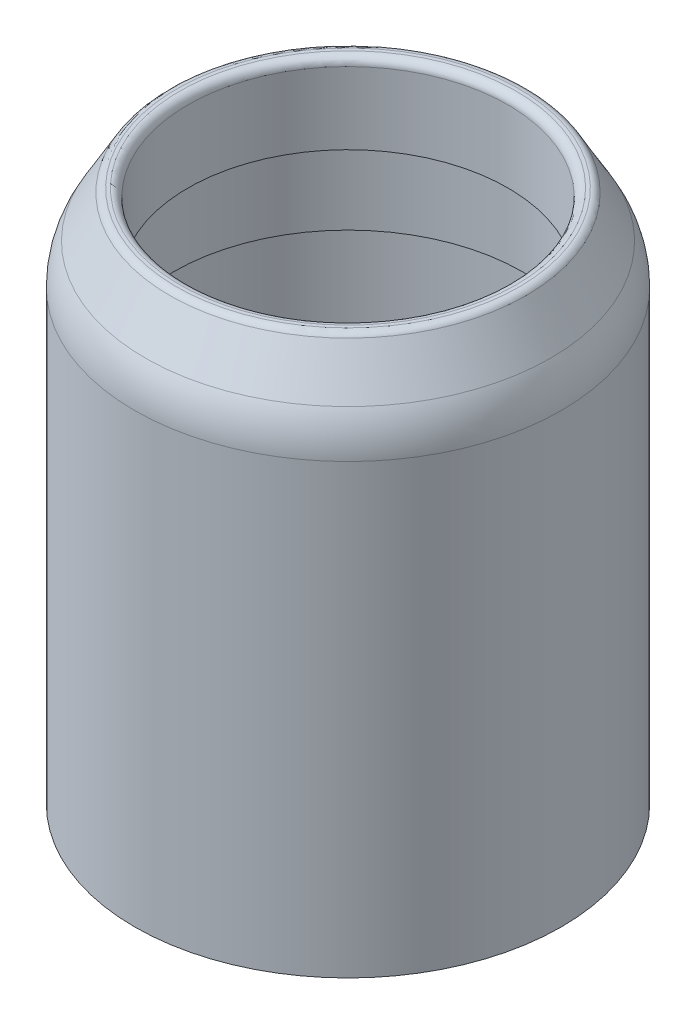
ISO-10303-21;
HEADER;
FILE_DESCRIPTION(('STEP AP214'),'2;1');
FILE_NAME('part.step','',(''),(''),'','','');
FILE_SCHEMA(('AUTOMOTIVE_DESIGN { 1 0 10303 214 1 1 1 1 }'));
ENDSEC;
DATA;
#1=APPLICATION_CONTEXT('core data for automotive mechanical design processes');
#2=APPLICATION_PROTOCOL_DEFINITION('international standard','automotive_design',2000,#1);
#3=PRODUCT_CONTEXT('',#1,'mechanical');
#4=PRODUCT('Part','Part','',(#3));
#5=PRODUCT_RELATED_PRODUCT_CATEGORY('part','',(#4));
#6=PRODUCT_DEFINITION_FORMATION('','',#4);
#7=PRODUCT_DEFINITION_CONTEXT('part definition',#1,'design');
#8=PRODUCT_DEFINITION('design','',#6,#7);
#9=PRODUCT_DEFINITION_SHAPE('','',#8);
#10=(LENGTH_UNIT() NAMED_UNIT(*) SI_UNIT(.MILLI.,.METRE.));
#11=(NAMED_UNIT(*) PLANE_ANGLE_UNIT() SI_UNIT($,.RADIAN.));
#12=(NAMED_UNIT(*) SI_UNIT($,.STERADIAN.) SOLID_ANGLE_UNIT());
#13=UNCERTAINTY_MEASURE_WITH_UNIT(LENGTH_MEASURE(1.E-05),#10,'distance_accuracy_value','');
#14=(GEOMETRIC_REPRESENTATION_CONTEXT(3) GLOBAL_UNCERTAINTY_ASSIGNED_CONTEXT((#13)) GLOBAL_UNIT_ASSIGNED_CONTEXT((#10,
#11,#12)) REPRESENTATION_CONTEXT('',''));
#15=CARTESIAN_POINT('',(0.,0.,0.));
#16=DIRECTION('',(0.,0.,1.));
#17=DIRECTION('',(1.,0.,0.));
#18=AXIS2_PLACEMENT_3D('',#15,#16,#17);
#19=CARTESIAN_POINT('',(6.,-0.3,0.));
#20=DIRECTION('',(0.,-1.,0.));
#21=DIRECTION('',(-0.999976494297205,0.,0.00685644609634003));
#22=AXIS2_PLACEMENT_3D('',#19,#20,#21);
#23=TOROIDAL_SURFACE('',#22,6.426794919243,0.3);
#24=CARTESIAN_POINT('',(6.,-0.1499999400314,0.));
#25=DIRECTION('',(0.,-1.,0.));
#26=DIRECTION('',(-1.,0.,0.));
#27=AXIS2_PLACEMENT_3D('',#24,#25,#26);
#28=CIRCLE('',#27,6.686602505756);
#29=CARTESIAN_POINT('',(12.6866025057556,-0.149999940031651,0.));
#30=VERTEX_POINT('',#29);
#31=CARTESIAN_POINT('',(12.6864453324648,-0.1499999400314,-0.0458463296483674));
#32=VERTEX_POINT('',#31);
#33=EDGE_CURVE('E129',#30,#32,#28,.T.);
#34=ORIENTED_EDGE('',*,*,#33,.F.);
#35=CARTESIAN_POINT('',(6.,-0.1499999400314,0.));
#36=DIRECTION('',(0.,-1.,0.));
#37=DIRECTION('',(-1.,0.,0.));
#38=AXIS2_PLACEMENT_3D('',#35,#36,#37);
#39=CIRCLE('',#38,6.686602505756);
#40=EDGE_CURVE('E28',#32,#30,#39,.T.);
#41=ORIENTED_EDGE('',*,*,#40,.F.);
#42=CARTESIAN_POINT('',(12.4266438529117,-0.3,-0.0440649729360208));
#43=DIRECTION('',(0.00685644609633991,0.,0.999976494297205));
#44=DIRECTION('',(0.999976494297205,0.,-0.00685644609633991));
#45=AXIS2_PLACEMENT_3D('',#42,#43,#44);
#46=CIRCLE('',#45,0.3);
#47=CARTESIAN_POINT('',(12.4266437255407,0.,-0.0440649720626879));
#48=VERTEX_POINT('',#47);
#49=EDGE_CURVE('E11',#32,#48,#46,.T.);
#50=ORIENTED_EDGE('',*,*,#49,.T.);
#51=CARTESIAN_POINT('',(6.,0.,0.));
#52=DIRECTION('',(0.,-1.,0.));
#53=DIRECTION('',(-1.,0.,0.));
#54=AXIS2_PLACEMENT_3D('',#51,#52,#53);
#55=CIRCLE('',#54,6.426794791869);
#56=EDGE_CURVE('E136',#48,#48,#55,.T.);
#57=ORIENTED_EDGE('',*,*,#56,.T.);
#58=ORIENTED_EDGE('',*,*,#49,.F.);
#59=EDGE_LOOP('',(#34,#41,#50,#57,#58));
#60=FACE_BOUND('',#59,.T.);
#61=ADVANCED_FACE('F17',(#60),#23,.T.);
#62=CARTESIAN_POINT('',(6.,-0.9393592638354,0.));
#63=DIRECTION('',(0.,-1.,0.));
#64=DIRECTION('',(-1.,0.,0.));
#65=AXIS2_PLACEMENT_3D('',#62,#63,#64);
#66=CONICAL_SURFACE('',#65,7.142339323841,0.523598775598299);
#67=CARTESIAN_POINT('',(6.,-1.72871870789,0.));
#68=DIRECTION('',(0.,1.,0.));
#69=DIRECTION('',(-1.,0.,0.));
#70=AXIS2_PLACEMENT_3D('',#67,#68,#69);
#71=CIRCLE('',#70,7.598076211353);
#72=CARTESIAN_POINT('',(13.598076211353,-1.72871870789,0.));
#73=VERTEX_POINT('',#72);
#74=EDGE_CURVE('E152',#73,#73,#71,.T.);
#75=ORIENTED_EDGE('',*,*,#74,.T.);
#76=DIRECTION('',(-0.5,0.866025403784439,0.));
#77=VECTOR('',#76,1.);
#78=CARTESIAN_POINT('',(13.142339323841,-0.9393592638354,0.));
#79=LINE('',#78,#77);
#80=EDGE_CURVE('E133',#73,#30,#79,.T.);
#81=ORIENTED_EDGE('',*,*,#80,.T.);
#82=ORIENTED_EDGE('',*,*,#33,.T.);
#83=ORIENTED_EDGE('',*,*,#40,.T.);
#84=ORIENTED_EDGE('',*,*,#80,.F.);
#85=EDGE_LOOP('',(#75,#81,#82,#83,#84));
#86=FACE_BOUND('',#85,.T.);
#87=ADVANCED_FACE('F19',(#86),#66,.T.);
#88=CARTESIAN_POINT('',(6.,-3.22871870789,0.));
#89=DIRECTION('',(0.,-1.,0.));
#90=DIRECTION('',(-1.,0.,0.));
#91=AXIS2_PLACEMENT_3D('',#88,#89,#90);
#92=TOROIDAL_SURFACE('',#91,5.,3.);
#93=CARTESIAN_POINT('',(6.,-3.22871870789,0.));
#94=DIRECTION('',(0.,-1.,0.));
#95=DIRECTION('',(-1.,0.,0.));
#96=AXIS2_PLACEMENT_3D('',#93,#94,#95);
#97=CIRCLE('',#96,8.);
#98=CARTESIAN_POINT('',(14.,-3.22871870789,0.));
#99=VERTEX_POINT('',#98);
#100=EDGE_CURVE('E114',#99,#99,#97,.T.);
#101=ORIENTED_EDGE('',*,*,#100,.F.);
#102=CARTESIAN_POINT('',(11.,-3.22871870789,0.));
#103=DIRECTION('',(0.,0.,1.));
#104=DIRECTION('',(1.,0.,0.));
#105=AXIS2_PLACEMENT_3D('',#102,#103,#104);
#106=CIRCLE('',#105,3.);
#107=EDGE_CURVE('E187',#99,#73,#106,.T.);
#108=ORIENTED_EDGE('',*,*,#107,.T.);
#109=ORIENTED_EDGE('',*,*,#74,.F.);
#110=ORIENTED_EDGE('',*,*,#107,.F.);
#111=EDGE_LOOP('',(#101,#108,#109,#110));
#112=FACE_BOUND('',#111,.T.);
#113=ADVANCED_FACE('F202',(#112),#92,.T.);
#114=CARTESIAN_POINT('',(6.,1.,0.));
#115=DIRECTION('',(0.,-1.,0.));
#116=DIRECTION('',(-1.,0.,0.));
#117=AXIS2_PLACEMENT_3D('',#114,#115,#116);
#118=CYLINDRICAL_SURFACE('',#117,8.);
#119=CARTESIAN_POINT('',(6.,-20.,0.));
#120=DIRECTION('',(0.,-1.,0.));
#121=DIRECTION('',(-1.,0.,0.));
#122=AXIS2_PLACEMENT_3D('',#119,#120,#121);
#123=CIRCLE('',#122,8.);
#124=CARTESIAN_POINT('',(14.,-20.,0.));
#125=VERTEX_POINT('',#124);
#126=EDGE_CURVE('E100',#125,#125,#123,.T.);
#127=ORIENTED_EDGE('',*,*,#126,.F.);
#128=DIRECTION('',(0.,1.,0.));
#129=VECTOR('',#128,1.);
#130=CARTESIAN_POINT('',(14.,1.,0.));
#131=LINE('',#130,#129);
#132=EDGE_CURVE('E108',#125,#99,#131,.T.);
#133=ORIENTED_EDGE('',*,*,#132,.T.);
#134=ORIENTED_EDGE('',*,*,#100,.T.);
#135=ORIENTED_EDGE('',*,*,#132,.F.);
#136=EDGE_LOOP('',(#127,#133,#134,#135));
#137=FACE_BOUND('',#136,.T.);
#138=ADVANCED_FACE('F201',(#137),#118,.T.);
#139=CARTESIAN_POINT('',(6.,-20.,0.));
#140=DIRECTION('',(0.,-1.,0.));
#141=DIRECTION('',(0.,0.,-1.));
#142=AXIS2_PLACEMENT_3D('',#139,#140,#141);
#143=PLANE('',#142);
#144=CARTESIAN_POINT('',(6.,-20.,0.));
#145=DIRECTION('',(0.,-1.,0.));
#146=DIRECTION('',(-1.,0.,0.));
#147=AXIS2_PLACEMENT_3D('',#144,#145,#146);
#148=CIRCLE('',#147,6.55);
#149=CARTESIAN_POINT('',(12.55,-20.,0.));
#150=VERTEX_POINT('',#149);
#151=EDGE_CURVE('E93',#150,#150,#148,.T.);
#152=ORIENTED_EDGE('',*,*,#151,.F.);
#153=EDGE_LOOP('',(#152));
#154=FACE_BOUND('',#153,.T.);
#155=ORIENTED_EDGE('',*,*,#126,.T.);
#156=EDGE_LOOP('',(#155));
#157=FACE_BOUND('',#156,.T.);
#158=ADVANCED_FACE('F225',(#154,#157),#143,.T.);
#159=CARTESIAN_POINT('',(6.,1.,0.));
#160=DIRECTION('',(0.,-1.,0.));
#161=DIRECTION('',(-1.,0.,0.));
#162=AXIS2_PLACEMENT_3D('',#159,#160,#161);
#163=CYLINDRICAL_SURFACE('',#162,6.55);
#164=CARTESIAN_POINT('',(6.,-18.,0.));
#165=DIRECTION('',(0.,-1.,0.));
#166=DIRECTION('',(-1.,0.,0.));
#167=AXIS2_PLACEMENT_3D('',#164,#165,#166);
#168=CIRCLE('',#167,6.55);
#169=CARTESIAN_POINT('',(12.55,-18.,0.));
#170=VERTEX_POINT('',#169);
#171=EDGE_CURVE('E110',#170,#170,#168,.T.);
#172=ORIENTED_EDGE('',*,*,#171,.F.);
#173=DIRECTION('',(0.,-1.,0.));
#174=VECTOR('',#173,1.);
#175=CARTESIAN_POINT('',(12.55,1.,0.));
#176=LINE('',#175,#174);
#177=EDGE_CURVE('E96',#170,#150,#176,.T.);
#178=ORIENTED_EDGE('',*,*,#177,.T.);
#179=ORIENTED_EDGE('',*,*,#151,.T.);
#180=ORIENTED_EDGE('',*,*,#177,.F.);
#181=EDGE_LOOP('',(#172,#178,#179,#180));
#182=FACE_BOUND('',#181,.T.);
#183=ADVANCED_FACE('F95',(#182),#163,.F.);
#184=CARTESIAN_POINT('',(6.,-18.,0.));
#185=DIRECTION('',(0.,-1.,0.));
#186=DIRECTION('',(0.,0.,-1.));
#187=AXIS2_PLACEMENT_3D('',#184,#185,#186);
#188=PLANE('',#187);
#189=ORIENTED_EDGE('',*,*,#171,.T.);
#190=EDGE_LOOP('',(#189));
#191=FACE_BOUND('',#190,.T.);
#192=CARTESIAN_POINT('',(6.,-18.,0.));
#193=DIRECTION('',(0.,-1.,0.));
#194=DIRECTION('',(-1.,0.,0.));
#195=AXIS2_PLACEMENT_3D('',#192,#193,#194);
#196=CIRCLE('',#195,6.75);
#197=CARTESIAN_POINT('',(12.75,-18.,0.));
#198=VERTEX_POINT('',#197);
#199=EDGE_CURVE('E120',#198,#198,#196,.T.);
#200=ORIENTED_EDGE('',*,*,#199,.F.);
#201=EDGE_LOOP('',(#200));
#202=FACE_BOUND('',#201,.T.);
#203=ADVANCED_FACE('F237',(#191,#202),#188,.F.);
#204=CARTESIAN_POINT('',(6.,1.,0.));
#205=DIRECTION('',(0.,-1.,0.));
#206=DIRECTION('',(-1.,0.,0.));
#207=AXIS2_PLACEMENT_3D('',#204,#205,#206);
#208=CYLINDRICAL_SURFACE('',#207,6.75);
#209=CARTESIAN_POINT('',(6.,-6.,0.));
#210=DIRECTION('',(0.,-1.,0.));
#211=DIRECTION('',(-1.,0.,0.));
#212=AXIS2_PLACEMENT_3D('',#209,#210,#211);
#213=CIRCLE('',#212,6.75);
#214=CARTESIAN_POINT('',(12.75,-6.,0.));
#215=VERTEX_POINT('',#214);
#216=EDGE_CURVE('E21',#215,#215,#213,.T.);
#217=ORIENTED_EDGE('',*,*,#216,.F.);
#218=DIRECTION('',(0.,-1.,0.));
#219=VECTOR('',#218,1.);
#220=CARTESIAN_POINT('',(12.75,1.,0.));
#221=LINE('',#220,#219);
#222=EDGE_CURVE('E116',#215,#198,#221,.T.);
#223=ORIENTED_EDGE('',*,*,#222,.T.);
#224=ORIENTED_EDGE('',*,*,#199,.T.);
#225=ORIENTED_EDGE('',*,*,#222,.F.);
#226=EDGE_LOOP('',(#217,#223,#224,#225));
#227=FACE_BOUND('',#226,.T.);
#228=ADVANCED_FACE('F235',(#227),#208,.F.);
#229=CARTESIAN_POINT('',(6.,-6.,0.));
#230=DIRECTION('',(0.,-1.,0.));
#231=DIRECTION('',(0.,0.,-1.));
#232=AXIS2_PLACEMENT_3D('',#229,#230,#231);
#233=PLANE('',#232);
#234=CARTESIAN_POINT('',(6.,-6.,0.));
#235=DIRECTION('',(0.,-1.,0.));
#236=DIRECTION('',(-1.,0.,0.));
#237=AXIS2_PLACEMENT_3D('',#234,#235,#236);
#238=CIRCLE('',#237,6.55);
#239=CARTESIAN_POINT('',(12.55,-6.,0.));
#240=VERTEX_POINT('',#239);
#241=EDGE_CURVE('E148',#240,#240,#238,.T.);
#242=ORIENTED_EDGE('',*,*,#241,.F.);
#243=EDGE_LOOP('',(#242));
#244=FACE_BOUND('',#243,.T.);
#245=ORIENTED_EDGE('',*,*,#216,.T.);
#246=EDGE_LOOP('',(#245));
#247=FACE_BOUND('',#246,.T.);
#248=ADVANCED_FACE('F244',(#244,#247),#233,.T.);
#249=CARTESIAN_POINT('',(6.,1.,0.));
#250=DIRECTION('',(0.,-1.,0.));
#251=DIRECTION('',(-1.,0.,0.));
#252=AXIS2_PLACEMENT_3D('',#249,#250,#251);
#253=CYLINDRICAL_SURFACE('',#252,6.55);
#254=CARTESIAN_POINT('',(6.,-3.,0.));
#255=DIRECTION('',(0.,-1.,0.));
#256=DIRECTION('',(-1.,0.,0.));
#257=AXIS2_PLACEMENT_3D('',#254,#255,#256);
#258=CIRCLE('',#257,6.55);
#259=CARTESIAN_POINT('',(12.55,-3.,0.));
#260=VERTEX_POINT('',#259);
#261=EDGE_CURVE('E127',#260,#260,#258,.T.);
#262=ORIENTED_EDGE('',*,*,#261,.F.);
#263=DIRECTION('',(0.,-1.,0.));
#264=VECTOR('',#263,1.);
#265=CARTESIAN_POINT('',(12.55,1.,0.));
#266=LINE('',#265,#264);
#267=EDGE_CURVE('E144',#260,#240,#266,.T.);
#268=ORIENTED_EDGE('',*,*,#267,.T.);
#269=ORIENTED_EDGE('',*,*,#241,.T.);
#270=ORIENTED_EDGE('',*,*,#267,.F.);
#271=EDGE_LOOP('',(#262,#268,#269,#270));
#272=FACE_BOUND('',#271,.T.);
#273=ADVANCED_FACE('F167',(#272),#253,.F.);
#274=CARTESIAN_POINT('',(6.,-3.,0.));
#275=DIRECTION('',(0.,-1.,0.));
#276=DIRECTION('',(0.,0.,-1.));
#277=AXIS2_PLACEMENT_3D('',#274,#275,#276);
#278=PLANE('',#277);
#279=CARTESIAN_POINT('',(6.,-3.,0.));
#280=DIRECTION('',(0.,-1.,0.));
#281=DIRECTION('',(-1.,0.,0.));
#282=AXIS2_PLACEMENT_3D('',#279,#280,#281);
#283=CIRCLE('',#282,6.);
#284=CARTESIAN_POINT('',(12.,-3.,0.));
#285=VERTEX_POINT('',#284);
#286=EDGE_CURVE('E123',#285,#285,#283,.T.);
#287=ORIENTED_EDGE('',*,*,#286,.F.);
#288=EDGE_LOOP('',(#287));
#289=FACE_BOUND('',#288,.T.);
#290=ORIENTED_EDGE('',*,*,#261,.T.);
#291=EDGE_LOOP('',(#290));
#292=FACE_BOUND('',#291,.T.);
#293=ADVANCED_FACE('F165',(#289,#292),#278,.T.);
#294=CARTESIAN_POINT('',(6.,1.,0.));
#295=DIRECTION('',(0.,-1.,0.));
#296=DIRECTION('',(-1.,0.,0.));
#297=AXIS2_PLACEMENT_3D('',#294,#295,#296);
#298=CYLINDRICAL_SURFACE('',#297,6.);
#299=CARTESIAN_POINT('',(6.,-0.3,0.));
#300=DIRECTION('',(0.,-1.,0.));
#301=DIRECTION('',(-1.,0.,0.));
#302=AXIS2_PLACEMENT_3D('',#299,#300,#301);
#303=CIRCLE('',#302,6.);
#304=CARTESIAN_POINT('',(12.,-0.3,0.));
#305=VERTEX_POINT('',#304);
#306=EDGE_CURVE('E153',#305,#305,#303,.T.);
#307=ORIENTED_EDGE('',*,*,#306,.F.);
#308=DIRECTION('',(0.,-1.,0.));
#309=VECTOR('',#308,1.);
#310=CARTESIAN_POINT('',(12.,1.,0.));
#311=LINE('',#310,#309);
#312=EDGE_CURVE('E128',#305,#285,#311,.T.);
#313=ORIENTED_EDGE('',*,*,#312,.T.);
#314=ORIENTED_EDGE('',*,*,#286,.T.);
#315=ORIENTED_EDGE('',*,*,#312,.F.);
#316=EDGE_LOOP('',(#307,#313,#314,#315));
#317=FACE_BOUND('',#316,.T.);
#318=ADVANCED_FACE('F217',(#317),#298,.F.);
#319=CARTESIAN_POINT('',(6.,-0.3,0.));
#320=DIRECTION('',(0.,-1.,0.));
#321=DIRECTION('',(-1.,0.,0.));
#322=AXIS2_PLACEMENT_3D('',#319,#320,#321);
#323=TOROIDAL_SURFACE('',#322,6.3,0.3);
#324=CARTESIAN_POINT('',(6.,0.,0.));
#325=DIRECTION('',(0.,-1.,0.));
#326=DIRECTION('',(-1.,0.,0.));
#327=AXIS2_PLACEMENT_3D('',#324,#325,#326);
#328=CIRCLE('',#327,6.3);
#329=CARTESIAN_POINT('',(12.3,0.,0.));
#330=VERTEX_POINT('',#329);
#331=EDGE_CURVE('E139',#330,#330,#328,.T.);
#332=ORIENTED_EDGE('',*,*,#331,.F.);
#333=CARTESIAN_POINT('',(12.3,-0.3,0.));
#334=DIRECTION('',(0.,0.,1.));
#335=DIRECTION('',(1.,0.,0.));
#336=AXIS2_PLACEMENT_3D('',#333,#334,#335);
#337=CIRCLE('',#336,0.3);
#338=EDGE_CURVE('E142',#330,#305,#337,.T.);
#339=ORIENTED_EDGE('',*,*,#338,.T.);
#340=ORIENTED_EDGE('',*,*,#306,.T.);
#341=ORIENTED_EDGE('',*,*,#338,.F.);
#342=EDGE_LOOP('',(#332,#339,#340,#341));
#343=FACE_BOUND('',#342,.T.);
#344=ADVANCED_FACE('F213',(#343),#323,.T.);
#345=CARTESIAN_POINT('',(6.,0.,0.));
#346=DIRECTION('',(0.,-1.,0.));
#347=DIRECTION('',(0.,0.,-1.));
#348=AXIS2_PLACEMENT_3D('',#345,#346,#347);
#349=PLANE('',#348);
#350=ORIENTED_EDGE('',*,*,#331,.T.);
#351=EDGE_LOOP('',(#350));
#352=FACE_BOUND('',#351,.T.);
#353=ORIENTED_EDGE('',*,*,#56,.F.);
#354=EDGE_LOOP('',(#353));
#355=FACE_BOUND('',#354,.T.);
#356=ADVANCED_FACE('F216',(#352,#355),#349,.F.);
#357=CLOSED_SHELL('',(#61,#87,#113,#138,#158,#183,#203,#228,#248,#273,#293,#318,#344,#356));
#358=MANIFOLD_SOLID_BREP('B1',#357);
#359=ADVANCED_BREP_SHAPE_REPRESENTATION('',(#18,#358),#14);
#360=SHAPE_DEFINITION_REPRESENTATION(#9,#359);
ENDSEC;
END-ISO-10303-21;
